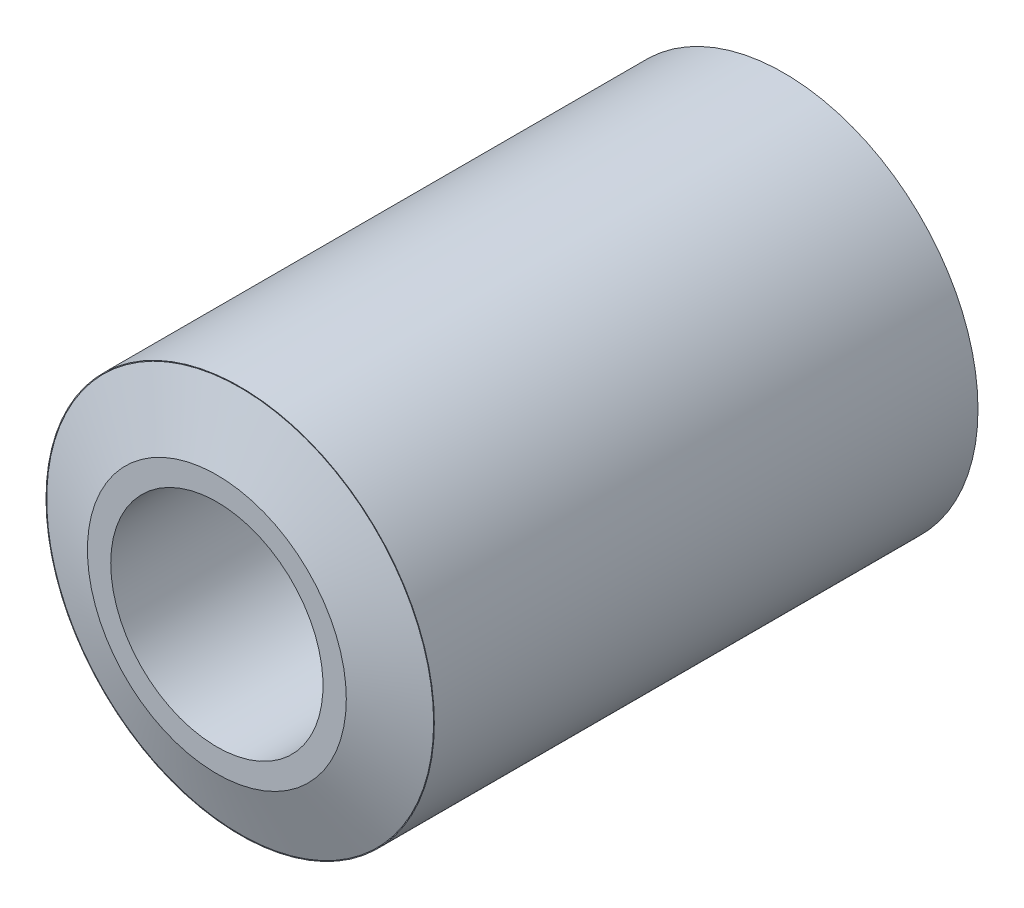
ISO-10303-21;
HEADER;
FILE_DESCRIPTION(('STEP AP214'),'2;1');
FILE_NAME('part.step','',(''),(''),'','','');
FILE_SCHEMA(('AUTOMOTIVE_DESIGN { 1 0 10303 214 1 1 1 1 }'));
ENDSEC;
DATA;
#1=APPLICATION_CONTEXT('core data for automotive mechanical design processes');
#2=APPLICATION_PROTOCOL_DEFINITION('international standard','automotive_design',2000,#1);
#3=PRODUCT_CONTEXT('',#1,'mechanical');
#4=PRODUCT('Part','Part','',(#3));
#5=PRODUCT_RELATED_PRODUCT_CATEGORY('part','',(#4));
#6=PRODUCT_DEFINITION_FORMATION('','',#4);
#7=PRODUCT_DEFINITION_CONTEXT('part definition',#1,'design');
#8=PRODUCT_DEFINITION('design','',#6,#7);
#9=PRODUCT_DEFINITION_SHAPE('','',#8);
#10=(LENGTH_UNIT() NAMED_UNIT(*) SI_UNIT(.MILLI.,.METRE.));
#11=(NAMED_UNIT(*) PLANE_ANGLE_UNIT() SI_UNIT($,.RADIAN.));
#12=(NAMED_UNIT(*) SI_UNIT($,.STERADIAN.) SOLID_ANGLE_UNIT());
#13=UNCERTAINTY_MEASURE_WITH_UNIT(LENGTH_MEASURE(1.E-05),#10,'distance_accuracy_value','');
#14=(GEOMETRIC_REPRESENTATION_CONTEXT(3) GLOBAL_UNCERTAINTY_ASSIGNED_CONTEXT((#13)) GLOBAL_UNIT_ASSIGNED_CONTEXT((#10,
#11,#12)) REPRESENTATION_CONTEXT('',''));
#15=CARTESIAN_POINT('',(0.,0.,0.));
#16=DIRECTION('',(0.,0.,1.));
#17=DIRECTION('',(1.,0.,0.));
#18=AXIS2_PLACEMENT_3D('',#15,#16,#17);
#19=CARTESIAN_POINT('',(0.,0.,21.));
#20=DIRECTION('',(0.,0.,1.));
#21=DIRECTION('',(1.,0.,0.));
#22=AXIS2_PLACEMENT_3D('',#19,#20,#21);
#23=PLANE('',#22);
#24=CARTESIAN_POINT('',(0.,0.,21.));
#25=DIRECTION('',(0.,0.,1.));
#26=DIRECTION('',(1.,0.,0.));
#27=AXIS2_PLACEMENT_3D('',#24,#25,#26);
#28=CIRCLE('',#27,7.47272967750921);
#29=CARTESIAN_POINT('',(7.47272967750921,0.,21.));
#30=VERTEX_POINT('',#29);
#31=EDGE_CURVE('E11',#30,#30,#28,.F.);
#32=ORIENTED_EDGE('',*,*,#31,.T.);
#33=EDGE_LOOP('',(#32));
#34=FACE_BOUND('',#33,.T.);
#35=CARTESIAN_POINT('',(0.,0.,21.));
#36=DIRECTION('',(0.,0.,1.));
#37=DIRECTION('',(1.,0.,0.));
#38=AXIS2_PLACEMENT_3D('',#35,#36,#37);
#39=CIRCLE('',#38,7.5);
#40=CARTESIAN_POINT('',(-7.5,0.,21.));
#41=VERTEX_POINT('',#40);
#42=EDGE_CURVE('E63',#41,#41,#39,.T.);
#43=ORIENTED_EDGE('',*,*,#42,.T.);
#44=EDGE_LOOP('',(#43));
#45=FACE_BOUND('',#44,.T.);
#46=ADVANCED_FACE('F49',(#34,#45),#23,.T.);
#47=CARTESIAN_POINT('',(0.,0.,0.));
#48=DIRECTION('',(0.,0.,1.));
#49=DIRECTION('',(1.,0.,0.));
#50=AXIS2_PLACEMENT_3D('',#47,#48,#49);
#51=PLANE('',#50);
#52=CARTESIAN_POINT('',(0.,0.,0.));
#53=DIRECTION('',(0.,0.,1.));
#54=DIRECTION('',(1.,0.,0.));
#55=AXIS2_PLACEMENT_3D('',#52,#53,#54);
#56=CIRCLE('',#55,7.47272967750921);
#57=CARTESIAN_POINT('',(7.47272967750921,0.,0.));
#58=VERTEX_POINT('',#57);
#59=EDGE_CURVE('E58',#58,#58,#56,.T.);
#60=ORIENTED_EDGE('',*,*,#59,.T.);
#61=EDGE_LOOP('',(#60));
#62=FACE_BOUND('',#61,.T.);
#63=CARTESIAN_POINT('',(0.,0.,0.));
#64=DIRECTION('',(0.,0.,1.));
#65=DIRECTION('',(1.,0.,0.));
#66=AXIS2_PLACEMENT_3D('',#63,#64,#65);
#67=CIRCLE('',#66,7.5);
#68=CARTESIAN_POINT('',(-7.5,0.,0.));
#69=VERTEX_POINT('',#68);
#70=EDGE_CURVE('E68',#69,#69,#67,.T.);
#71=ORIENTED_EDGE('',*,*,#70,.F.);
#72=EDGE_LOOP('',(#71));
#73=FACE_BOUND('',#72,.T.);
#74=ADVANCED_FACE('F101',(#62,#73),#51,.F.);
#75=CARTESIAN_POINT('',(0.,0.,21.));
#76=DIRECTION('',(0.,0.,-1.));
#77=DIRECTION('',(-1.,0.,0.));
#78=AXIS2_PLACEMENT_3D('',#75,#76,#77);
#79=CYLINDRICAL_SURFACE('',#78,7.5);
#80=CARTESIAN_POINT('',(-7.5,0.,21.));
#81=CARTESIAN_POINT('',(-7.5,0.,20.78125));
#82=CARTESIAN_POINT('',(-7.5,0.,20.5625));
#83=CARTESIAN_POINT('',(-7.5,0.,20.125));
#84=CARTESIAN_POINT('',(-7.5,0.,19.90625));
#85=CARTESIAN_POINT('',(-7.5,0.,19.46875));
#86=CARTESIAN_POINT('',(-7.5,0.,19.25));
#87=CARTESIAN_POINT('',(-7.5,0.,18.8125));
#88=CARTESIAN_POINT('',(-7.5,0.,18.59375));
#89=CARTESIAN_POINT('',(-7.5,0.,18.15625));
#90=CARTESIAN_POINT('',(-7.5,0.,17.9375));
#91=CARTESIAN_POINT('',(-7.5,0.,17.5));
#92=CARTESIAN_POINT('',(-7.5,0.,17.28125));
#93=CARTESIAN_POINT('',(-7.5,0.,16.84375));
#94=CARTESIAN_POINT('',(-7.5,0.,16.625));
#95=CARTESIAN_POINT('',(-7.5,0.,16.1875));
#96=CARTESIAN_POINT('',(-7.5,0.,15.96875));
#97=CARTESIAN_POINT('',(-7.5,0.,15.53125));
#98=CARTESIAN_POINT('',(-7.5,0.,15.3125));
#99=CARTESIAN_POINT('',(-7.5,0.,14.875));
#100=CARTESIAN_POINT('',(-7.5,0.,14.65625));
#101=CARTESIAN_POINT('',(-7.5,0.,14.21875));
#102=CARTESIAN_POINT('',(-7.5,0.,14.));
#103=CARTESIAN_POINT('',(-7.5,0.,13.5625));
#104=CARTESIAN_POINT('',(-7.5,0.,13.34375));
#105=CARTESIAN_POINT('',(-7.5,0.,12.90625));
#106=CARTESIAN_POINT('',(-7.5,0.,12.6875));
#107=CARTESIAN_POINT('',(-7.5,0.,12.25));
#108=CARTESIAN_POINT('',(-7.5,0.,12.03125));
#109=CARTESIAN_POINT('',(-7.5,0.,11.59375));
#110=CARTESIAN_POINT('',(-7.5,0.,11.375));
#111=CARTESIAN_POINT('',(-7.5,0.,10.9375));
#112=CARTESIAN_POINT('',(-7.5,0.,10.71875));
#113=CARTESIAN_POINT('',(-7.5,0.,10.28125));
#114=CARTESIAN_POINT('',(-7.5,0.,10.0625));
#115=CARTESIAN_POINT('',(-7.5,0.,9.625));
#116=CARTESIAN_POINT('',(-7.5,0.,9.40625));
#117=CARTESIAN_POINT('',(-7.5,0.,8.96875));
#118=CARTESIAN_POINT('',(-7.5,0.,8.75));
#119=CARTESIAN_POINT('',(-7.5,0.,8.3125));
#120=CARTESIAN_POINT('',(-7.5,0.,8.09375));
#121=CARTESIAN_POINT('',(-7.5,0.,7.65625));
#122=CARTESIAN_POINT('',(-7.5,0.,7.4375));
#123=CARTESIAN_POINT('',(-7.5,0.,7.));
#124=CARTESIAN_POINT('',(-7.5,0.,6.78125));
#125=CARTESIAN_POINT('',(-7.5,0.,6.34375));
#126=CARTESIAN_POINT('',(-7.5,0.,6.125));
#127=CARTESIAN_POINT('',(-7.5,0.,5.6875));
#128=CARTESIAN_POINT('',(-7.5,0.,5.46875));
#129=CARTESIAN_POINT('',(-7.5,0.,5.03125));
#130=CARTESIAN_POINT('',(-7.5,0.,4.8125));
#131=CARTESIAN_POINT('',(-7.5,0.,4.375));
#132=CARTESIAN_POINT('',(-7.5,0.,4.15625));
#133=CARTESIAN_POINT('',(-7.5,0.,3.71875));
#134=CARTESIAN_POINT('',(-7.5,0.,3.5));
#135=CARTESIAN_POINT('',(-7.5,0.,3.0625));
#136=CARTESIAN_POINT('',(-7.5,0.,2.84375));
#137=CARTESIAN_POINT('',(-7.5,0.,2.40625));
#138=CARTESIAN_POINT('',(-7.5,0.,2.1875));
#139=CARTESIAN_POINT('',(-7.5,0.,1.75));
#140=CARTESIAN_POINT('',(-7.5,0.,1.53125));
#141=CARTESIAN_POINT('',(-7.5,0.,1.09375));
#142=CARTESIAN_POINT('',(-7.5,0.,0.875000000000001));
#143=CARTESIAN_POINT('',(-7.5,0.,0.4375));
#144=CARTESIAN_POINT('',(-7.5,0.,0.21875));
#145=CARTESIAN_POINT('',(-7.5,0.,0.));
#146=B_SPLINE_CURVE_WITH_KNOTS('',3,(#80,#81,#82,#83,#84,#85,#86,#87,#88,#89,#90,#91,#92,#93,
#94,#95,#96,#97,#98,#99,#100,#101,#102,#103,#104,#105,#106,#107,#108,#109,#110,#111,#112,#113,
#114,#115,#116,#117,#118,#119,#120,#121,#122,#123,#124,#125,#126,#127,#128,#129,#130,#131,#132,
#133,#134,#135,#136,#137,#138,#139,#140,#141,#142,#143,#144,#145),.UNSPECIFIED.,.F.,.F.,(4,2,2,
2,2,2,2,2,2,2,2,2,2,2,2,2,2,2,2,2,2,2,2,2,2,2,2,2,2,2,2,2,4),(0.,0.656249999999997,1.3125,
1.96875,2.625,3.28125,3.9375,4.59375,5.25,5.90625,6.5625,7.21875,7.875,8.53125,9.1875,9.84375,
10.5,11.15625,11.8125,12.46875,13.125,13.78125,14.4375,15.09375,15.75,16.40625,17.0625,17.71875,
18.375,19.03125,19.6875,20.34375,21.),.UNSPECIFIED.);
#147=EDGE_CURVE('BSEAM107',#41,#69,#146,.T.);
#148=ORIENTED_EDGE('',*,*,#42,.F.);
#149=ORIENTED_EDGE('',*,*,#70,.T.);
#150=ORIENTED_EDGE('',*,*,#147,.T.);
#151=ORIENTED_EDGE('',*,*,#147,.F.);
#152=EDGE_LOOP('',(#148,#150,#149,#151));
#153=FACE_BOUND('',#152,.T.);
#154=ADVANCED_FACE('F107',(#153),#79,.T.);
#155=CARTESIAN_POINT('',(0.,0.,-0.9));
#156=DIRECTION('',(0.,0.,1.));
#157=DIRECTION('',(1.,0.,0.));
#158=AXIS2_PLACEMENT_3D('',#155,#156,#157);
#159=PLANE('',#158);
#160=CARTESIAN_POINT('',(0.,0.,-0.9));
#161=DIRECTION('',(0.,0.,1.));
#162=DIRECTION('',(1.,0.,0.));
#163=AXIS2_PLACEMENT_3D('',#160,#161,#162);
#164=CIRCLE('',#163,5.);
#165=CARTESIAN_POINT('',(5.,0.,-0.9));
#166=VERTEX_POINT('',#165);
#167=EDGE_CURVE('E80',#166,#166,#164,.T.);
#168=ORIENTED_EDGE('',*,*,#167,.F.);
#169=EDGE_LOOP('',(#168));
#170=FACE_BOUND('',#169,.T.);
#171=CARTESIAN_POINT('',(0.,0.,-0.9));
#172=DIRECTION('',(0.,0.,1.));
#173=DIRECTION('',(1.,0.,0.));
#174=AXIS2_PLACEMENT_3D('',#171,#172,#173);
#175=CIRCLE('',#174,4.1);
#176=CARTESIAN_POINT('',(-4.1,0.,-0.899999999999998));
#177=VERTEX_POINT('',#176);
#178=EDGE_CURVE('E79',#177,#177,#175,.T.);
#179=ORIENTED_EDGE('',*,*,#178,.T.);
#180=EDGE_LOOP('',(#179));
#181=FACE_BOUND('',#180,.T.);
#182=ADVANCED_FACE('F111',(#170,#181),#159,.F.);
#183=CARTESIAN_POINT('',(0.,0.,21.));
#184=DIRECTION('',(0.,0.,-1.));
#185=DIRECTION('',(-1.,0.,0.));
#186=AXIS2_PLACEMENT_3D('',#183,#184,#185);
#187=CYLINDRICAL_SURFACE('',#186,4.1);
#188=CARTESIAN_POINT('',(0.,0.,21.9));
#189=DIRECTION('',(0.,0.,1.));
#190=DIRECTION('',(1.,0.,0.));
#191=AXIS2_PLACEMENT_3D('',#188,#189,#190);
#192=CIRCLE('',#191,4.1);
#193=CARTESIAN_POINT('',(-4.1,0.,21.9));
#194=VERTEX_POINT('',#193);
#195=EDGE_CURVE('E75',#194,#194,#192,.T.);
#196=CARTESIAN_POINT('',(-4.1,0.,-0.899999999999998));
#197=CARTESIAN_POINT('',(-4.1,0.,-0.662499999999998));
#198=CARTESIAN_POINT('',(-4.1,0.,-0.424999999999997));
#199=CARTESIAN_POINT('',(-4.1,0.,0.0500000000000025));
#200=CARTESIAN_POINT('',(-4.1,0.,0.287500000000002));
#201=CARTESIAN_POINT('',(-4.1,0.,0.762500000000002));
#202=CARTESIAN_POINT('',(-4.1,0.,1.));
#203=CARTESIAN_POINT('',(-4.1,0.,1.475));
#204=CARTESIAN_POINT('',(-4.1,0.,1.7125));
#205=CARTESIAN_POINT('',(-4.1,0.,2.1875));
#206=CARTESIAN_POINT('',(-4.1,0.,2.425));
#207=CARTESIAN_POINT('',(-4.1,0.,2.9));
#208=CARTESIAN_POINT('',(-4.1,0.,3.1375));
#209=CARTESIAN_POINT('',(-4.1,0.,3.6125));
#210=CARTESIAN_POINT('',(-4.1,0.,3.85));
#211=CARTESIAN_POINT('',(-4.1,0.,4.325));
#212=CARTESIAN_POINT('',(-4.1,0.,4.5625));
#213=CARTESIAN_POINT('',(-4.1,0.,5.0375));
#214=CARTESIAN_POINT('',(-4.1,0.,5.275));
#215=CARTESIAN_POINT('',(-4.1,0.,5.75));
#216=CARTESIAN_POINT('',(-4.1,0.,5.9875));
#217=CARTESIAN_POINT('',(-4.1,0.,6.4625));
#218=CARTESIAN_POINT('',(-4.1,0.,6.7));
#219=CARTESIAN_POINT('',(-4.1,0.,7.175));
#220=CARTESIAN_POINT('',(-4.1,0.,7.4125));
#221=CARTESIAN_POINT('',(-4.1,0.,7.8875));
#222=CARTESIAN_POINT('',(-4.1,0.,8.125));
#223=CARTESIAN_POINT('',(-4.1,0.,8.6));
#224=CARTESIAN_POINT('',(-4.1,0.,8.8375));
#225=CARTESIAN_POINT('',(-4.1,0.,9.3125));
#226=CARTESIAN_POINT('',(-4.1,0.,9.55));
#227=CARTESIAN_POINT('',(-4.1,0.,10.025));
#228=CARTESIAN_POINT('',(-4.1,0.,10.2625));
#229=CARTESIAN_POINT('',(-4.1,0.,10.7375));
#230=CARTESIAN_POINT('',(-4.1,0.,10.975));
#231=CARTESIAN_POINT('',(-4.1,0.,11.45));
#232=CARTESIAN_POINT('',(-4.1,0.,11.6875));
#233=CARTESIAN_POINT('',(-4.1,0.,12.1625));
#234=CARTESIAN_POINT('',(-4.1,0.,12.4));
#235=CARTESIAN_POINT('',(-4.1,0.,12.875));
#236=CARTESIAN_POINT('',(-4.1,0.,13.1125));
#237=CARTESIAN_POINT('',(-4.1,0.,13.5875));
#238=CARTESIAN_POINT('',(-4.1,0.,13.825));
#239=CARTESIAN_POINT('',(-4.1,0.,14.3));
#240=CARTESIAN_POINT('',(-4.1,0.,14.5375));
#241=CARTESIAN_POINT('',(-4.1,0.,15.0125));
#242=CARTESIAN_POINT('',(-4.1,0.,15.25));
#243=CARTESIAN_POINT('',(-4.1,0.,15.725));
#244=CARTESIAN_POINT('',(-4.1,0.,15.9625));
#245=CARTESIAN_POINT('',(-4.1,0.,16.4375));
#246=CARTESIAN_POINT('',(-4.1,0.,16.675));
#247=CARTESIAN_POINT('',(-4.1,0.,17.15));
#248=CARTESIAN_POINT('',(-4.1,0.,17.3875));
#249=CARTESIAN_POINT('',(-4.1,0.,17.8625));
#250=CARTESIAN_POINT('',(-4.1,0.,18.1));
#251=CARTESIAN_POINT('',(-4.1,0.,18.575));
#252=CARTESIAN_POINT('',(-4.1,0.,18.8125));
#253=CARTESIAN_POINT('',(-4.1,0.,19.2875));
#254=CARTESIAN_POINT('',(-4.1,0.,19.525));
#255=CARTESIAN_POINT('',(-4.1,0.,20.));
#256=CARTESIAN_POINT('',(-4.1,0.,20.2375));
#257=CARTESIAN_POINT('',(-4.1,0.,20.7125));
#258=CARTESIAN_POINT('',(-4.1,0.,20.95));
#259=CARTESIAN_POINT('',(-4.1,0.,21.425));
#260=CARTESIAN_POINT('',(-4.1,0.,21.6625));
#261=CARTESIAN_POINT('',(-4.1,0.,21.9));
#262=B_SPLINE_CURVE_WITH_KNOTS('',3,(#196,#197,#198,#199,#200,#201,#202,#203,#204,#205,#206,
#207,#208,#209,#210,#211,#212,#213,#214,#215,#216,#217,#218,#219,#220,#221,#222,#223,#224,#225,
#226,#227,#228,#229,#230,#231,#232,#233,#234,#235,#236,#237,#238,#239,#240,#241,#242,#243,#244,
#245,#246,#247,#248,#249,#250,#251,#252,#253,#254,#255,#256,#257,#258,#259,#260,#261),
.UNSPECIFIED.,.F.,.F.,(4,2,2,2,2,2,2,2,2,2,2,2,2,2,2,2,2,2,2,2,2,2,2,2,2,2,2,2,2,2,2,2,4),(0.,
0.712500000000001,1.425,2.1375,2.85,3.5625,4.275,4.9875,5.7,6.4125,7.125,7.8375,8.55,9.2625,
9.975,10.6875,11.4,12.1125,12.825,13.5375,14.25,14.9625,15.675,16.3875,17.1,17.8125,18.525,
19.2375,19.95,20.6625,21.375,22.0875,22.8),.UNSPECIFIED.);
#263=EDGE_CURVE('BSEAM117',#177,#194,#262,.T.);
#264=ORIENTED_EDGE('',*,*,#178,.F.);
#265=ORIENTED_EDGE('',*,*,#195,.T.);
#266=ORIENTED_EDGE('',*,*,#263,.T.);
#267=ORIENTED_EDGE('',*,*,#263,.F.);
#268=EDGE_LOOP('',(#264,#266,#265,#267));
#269=FACE_BOUND('',#268,.T.);
#270=ADVANCED_FACE('F117',(#269),#187,.F.);
#271=CARTESIAN_POINT('',(0.,0.,21.9));
#272=DIRECTION('',(0.,0.,1.));
#273=DIRECTION('',(1.,0.,0.));
#274=AXIS2_PLACEMENT_3D('',#271,#272,#273);
#275=PLANE('',#274);
#276=ORIENTED_EDGE('',*,*,#195,.F.);
#277=EDGE_LOOP('',(#276));
#278=FACE_BOUND('',#277,.T.);
#279=CARTESIAN_POINT('',(0.,0.,21.9));
#280=DIRECTION('',(0.,0.,1.));
#281=DIRECTION('',(1.,0.,0.));
#282=AXIS2_PLACEMENT_3D('',#279,#280,#281);
#283=CIRCLE('',#282,5.);
#284=CARTESIAN_POINT('',(5.,0.,21.9));
#285=VERTEX_POINT('',#284);
#286=EDGE_CURVE('E73',#285,#285,#283,.T.);
#287=ORIENTED_EDGE('',*,*,#286,.T.);
#288=EDGE_LOOP('',(#287));
#289=FACE_BOUND('',#288,.T.);
#290=ADVANCED_FACE('F91',(#278,#289),#275,.T.);
#291=CARTESIAN_POINT('',(0.,0.,-0.899999999999998));
#292=DIRECTION('',(0.,0.,1.));
#293=DIRECTION('',(1.,0.,0.));
#294=AXIS2_PLACEMENT_3D('',#291,#292,#293);
#295=CONICAL_SURFACE('',#294,5.,1.22173047639604);
#296=ORIENTED_EDGE('',*,*,#59,.F.);
#297=EDGE_LOOP('',(#296));
#298=FACE_BOUND('',#297,.T.);
#299=ORIENTED_EDGE('',*,*,#167,.T.);
#300=EDGE_LOOP('',(#299));
#301=FACE_BOUND('',#300,.T.);
#302=ADVANCED_FACE('F95',(#298,#301),#295,.T.);
#303=CARTESIAN_POINT('',(0.,0.,21.));
#304=DIRECTION('',(0.,0.,-1.));
#305=DIRECTION('',(-1.,0.,0.));
#306=AXIS2_PLACEMENT_3D('',#303,#304,#305);
#307=CONICAL_SURFACE('',#306,7.47272967750921,1.22173047639604);
#308=ORIENTED_EDGE('',*,*,#286,.F.);
#309=EDGE_LOOP('',(#308));
#310=FACE_BOUND('',#309,.T.);
#311=ORIENTED_EDGE('',*,*,#31,.F.);
#312=EDGE_LOOP('',(#311));
#313=FACE_BOUND('',#312,.T.);
#314=ADVANCED_FACE('F52',(#310,#313),#307,.T.);
#315=CLOSED_SHELL('',(#46,#74,#154,#182,#270,#290,#302,#314));
#316=MANIFOLD_SOLID_BREP('B2',#315);
#317=ADVANCED_BREP_SHAPE_REPRESENTATION('',(#18,#316),#14);
#318=SHAPE_DEFINITION_REPRESENTATION(#9,#317);
ENDSEC;
END-ISO-10303-21;
